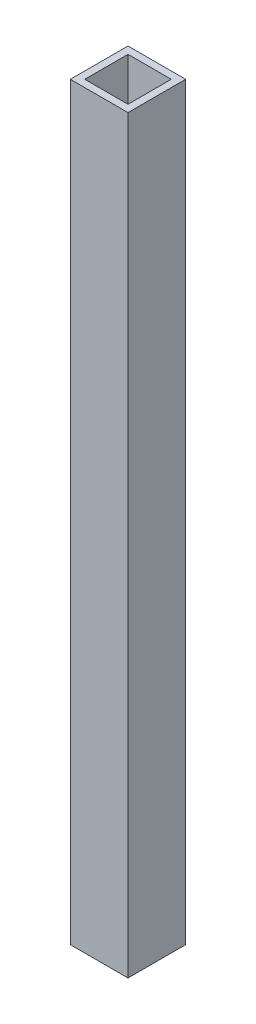
ISO-10303-21;
HEADER;
FILE_DESCRIPTION(('STEP AP214'),'2;1');
FILE_NAME('part.step','',(''),(''),'','','');
FILE_SCHEMA(('AUTOMOTIVE_DESIGN { 1 0 10303 214 1 1 1 1 }'));
ENDSEC;
DATA;
#1=APPLICATION_CONTEXT('core data for automotive mechanical design processes');
#2=APPLICATION_PROTOCOL_DEFINITION('international standard','automotive_design',2000,#1);
#3=PRODUCT_CONTEXT('',#1,'mechanical');
#4=PRODUCT('Part','Part','',(#3));
#5=PRODUCT_RELATED_PRODUCT_CATEGORY('part','',(#4));
#6=PRODUCT_DEFINITION_FORMATION('','',#4);
#7=PRODUCT_DEFINITION_CONTEXT('part definition',#1,'design');
#8=PRODUCT_DEFINITION('design','',#6,#7);
#9=PRODUCT_DEFINITION_SHAPE('','',#8);
#10=(LENGTH_UNIT() NAMED_UNIT(*) SI_UNIT(.MILLI.,.METRE.));
#11=(NAMED_UNIT(*) PLANE_ANGLE_UNIT() SI_UNIT($,.RADIAN.));
#12=(NAMED_UNIT(*) SI_UNIT($,.STERADIAN.) SOLID_ANGLE_UNIT());
#13=UNCERTAINTY_MEASURE_WITH_UNIT(LENGTH_MEASURE(1.E-05),#10,'distance_accuracy_value','');
#14=(GEOMETRIC_REPRESENTATION_CONTEXT(3) GLOBAL_UNCERTAINTY_ASSIGNED_CONTEXT((#13)) GLOBAL_UNIT_ASSIGNED_CONTEXT((#10,
#11,#12)) REPRESENTATION_CONTEXT('',''));
#15=CARTESIAN_POINT('',(0.,0.,0.));
#16=DIRECTION('',(0.,0.,1.));
#17=DIRECTION('',(1.,0.,0.));
#18=AXIS2_PLACEMENT_3D('',#15,#16,#17);
#19=CARTESIAN_POINT('',(0.,330.2,0.));
#20=DIRECTION('',(0.,1.,0.));
#21=DIRECTION('',(0.,0.,1.));
#22=AXIS2_PLACEMENT_3D('',#19,#20,#21);
#23=PLANE('',#22);
#24=DIRECTION('',(0.,0.,1.));
#25=VECTOR('',#24,1.);
#26=CARTESIAN_POINT('',(-12.7,330.2,-12.7));
#27=LINE('',#26,#25);
#28=CARTESIAN_POINT('',(-12.7,330.2,-12.7));
#29=VERTEX_POINT('',#28);
#30=CARTESIAN_POINT('',(-12.7,330.2,12.7));
#31=VERTEX_POINT('',#30);
#32=EDGE_CURVE('E134',#29,#31,#27,.T.);
#33=ORIENTED_EDGE('',*,*,#32,.T.);
#34=DIRECTION('',(1.,0.,0.));
#35=VECTOR('',#34,1.);
#36=CARTESIAN_POINT('',(-12.7,330.2,12.7));
#37=LINE('',#36,#35);
#38=CARTESIAN_POINT('',(12.7,330.2,12.7));
#39=VERTEX_POINT('',#38);
#40=EDGE_CURVE('E137',#31,#39,#37,.T.);
#41=ORIENTED_EDGE('',*,*,#40,.T.);
#42=DIRECTION('',(0.,0.,-1.));
#43=VECTOR('',#42,1.);
#44=CARTESIAN_POINT('',(12.7,330.2,-12.7));
#45=LINE('',#44,#43);
#46=CARTESIAN_POINT('',(12.7,330.2,-12.7));
#47=VERTEX_POINT('',#46);
#48=EDGE_CURVE('E140',#39,#47,#45,.T.);
#49=ORIENTED_EDGE('',*,*,#48,.T.);
#50=DIRECTION('',(-1.,0.,0.));
#51=VECTOR('',#50,1.);
#52=CARTESIAN_POINT('',(-12.7,330.2,-12.7));
#53=LINE('',#52,#51);
#54=EDGE_CURVE('E142',#47,#29,#53,.T.);
#55=ORIENTED_EDGE('',*,*,#54,.T.);
#56=EDGE_LOOP('',(#33,#41,#49,#55));
#57=FACE_BOUND('',#56,.T.);
#58=DIRECTION('',(1.,0.,0.));
#59=VECTOR('',#58,1.);
#60=CARTESIAN_POINT('',(-9.525,330.2,9.525));
#61=LINE('',#60,#59);
#62=CARTESIAN_POINT('',(-9.525,330.2,9.525));
#63=VERTEX_POINT('',#62);
#64=CARTESIAN_POINT('',(9.525,330.2,9.525));
#65=VERTEX_POINT('',#64);
#66=EDGE_CURVE('E106',#63,#65,#61,.T.);
#67=ORIENTED_EDGE('',*,*,#66,.F.);
#68=DIRECTION('',(0.,0.,1.));
#69=VECTOR('',#68,1.);
#70=CARTESIAN_POINT('',(-9.525,330.2,-9.525));
#71=LINE('',#70,#69);
#72=CARTESIAN_POINT('',(-9.525,330.2,-9.525));
#73=VERTEX_POINT('',#72);
#74=EDGE_CURVE('E98',#73,#63,#71,.T.);
#75=ORIENTED_EDGE('',*,*,#74,.F.);
#76=DIRECTION('',(-1.,0.,0.));
#77=VECTOR('',#76,1.);
#78=CARTESIAN_POINT('',(-9.525,330.2,-9.525));
#79=LINE('',#78,#77);
#80=CARTESIAN_POINT('',(9.525,330.2,-9.525));
#81=VERTEX_POINT('',#80);
#82=EDGE_CURVE('E120',#81,#73,#79,.T.);
#83=ORIENTED_EDGE('',*,*,#82,.F.);
#84=DIRECTION('',(0.,0.,-1.));
#85=VECTOR('',#84,1.);
#86=CARTESIAN_POINT('',(9.525,330.2,-9.525));
#87=LINE('',#86,#85);
#88=EDGE_CURVE('E118',#65,#81,#87,.T.);
#89=ORIENTED_EDGE('',*,*,#88,.F.);
#90=EDGE_LOOP('',(#67,#75,#83,#89));
#91=FACE_BOUND('',#90,.T.);
#92=ADVANCED_FACE('F33',(#57,#91),#23,.T.);
#93=CARTESIAN_POINT('',(0.,0.,0.));
#94=DIRECTION('',(0.,1.,0.));
#95=DIRECTION('',(0.,0.,1.));
#96=AXIS2_PLACEMENT_3D('',#93,#94,#95);
#97=PLANE('',#96);
#98=DIRECTION('',(0.,0.,1.));
#99=VECTOR('',#98,1.);
#100=CARTESIAN_POINT('',(-12.7,0.,-12.7));
#101=LINE('',#100,#99);
#102=CARTESIAN_POINT('',(-12.7,0.,-12.7));
#103=VERTEX_POINT('',#102);
#104=CARTESIAN_POINT('',(-12.7,0.,12.7));
#105=VERTEX_POINT('',#104);
#106=EDGE_CURVE('E114',#103,#105,#101,.T.);
#107=ORIENTED_EDGE('',*,*,#106,.F.);
#108=DIRECTION('',(-1.,0.,0.));
#109=VECTOR('',#108,1.);
#110=CARTESIAN_POINT('',(-12.7,0.,-12.7));
#111=LINE('',#110,#109);
#112=CARTESIAN_POINT('',(12.7,0.,-12.7));
#113=VERTEX_POINT('',#112);
#114=EDGE_CURVE('E138',#113,#103,#111,.T.);
#115=ORIENTED_EDGE('',*,*,#114,.F.);
#116=DIRECTION('',(0.,0.,-1.));
#117=VECTOR('',#116,1.);
#118=CARTESIAN_POINT('',(12.7,0.,-12.7));
#119=LINE('',#118,#117);
#120=CARTESIAN_POINT('',(12.7,0.,12.7));
#121=VERTEX_POINT('',#120);
#122=EDGE_CURVE('E149',#121,#113,#119,.T.);
#123=ORIENTED_EDGE('',*,*,#122,.F.);
#124=DIRECTION('',(1.,0.,0.));
#125=VECTOR('',#124,1.);
#126=CARTESIAN_POINT('',(-12.7,0.,12.7));
#127=LINE('',#126,#125);
#128=EDGE_CURVE('E147',#105,#121,#127,.T.);
#129=ORIENTED_EDGE('',*,*,#128,.F.);
#130=EDGE_LOOP('',(#107,#115,#123,#129));
#131=FACE_BOUND('',#130,.T.);
#132=DIRECTION('',(0.,0.,1.));
#133=VECTOR('',#132,1.);
#134=CARTESIAN_POINT('',(-9.525,0.,-9.525));
#135=LINE('',#134,#133);
#136=CARTESIAN_POINT('',(-9.525,0.,-9.525));
#137=VERTEX_POINT('',#136);
#138=CARTESIAN_POINT('',(-9.525,0.,9.525));
#139=VERTEX_POINT('',#138);
#140=EDGE_CURVE('E56',#137,#139,#135,.T.);
#141=ORIENTED_EDGE('',*,*,#140,.T.);
#142=DIRECTION('',(1.,0.,0.));
#143=VECTOR('',#142,1.);
#144=CARTESIAN_POINT('',(-9.525,0.,9.525));
#145=LINE('',#144,#143);
#146=CARTESIAN_POINT('',(9.525,0.,9.525));
#147=VERTEX_POINT('',#146);
#148=EDGE_CURVE('E113',#139,#147,#145,.T.);
#149=ORIENTED_EDGE('',*,*,#148,.T.);
#150=DIRECTION('',(0.,0.,-1.));
#151=VECTOR('',#150,1.);
#152=CARTESIAN_POINT('',(9.525,0.,-9.525));
#153=LINE('',#152,#151);
#154=CARTESIAN_POINT('',(9.525,0.,-9.525));
#155=VERTEX_POINT('',#154);
#156=EDGE_CURVE('E126',#147,#155,#153,.T.);
#157=ORIENTED_EDGE('',*,*,#156,.T.);
#158=DIRECTION('',(-1.,0.,0.));
#159=VECTOR('',#158,1.);
#160=CARTESIAN_POINT('',(-9.525,0.,-9.525));
#161=LINE('',#160,#159);
#162=EDGE_CURVE('E107',#155,#137,#161,.T.);
#163=ORIENTED_EDGE('',*,*,#162,.T.);
#164=EDGE_LOOP('',(#141,#149,#157,#163));
#165=FACE_BOUND('',#164,.T.);
#166=ADVANCED_FACE('F167',(#131,#165),#97,.F.);
#167=CARTESIAN_POINT('',(-12.7,330.2,-12.7));
#168=DIRECTION('',(1.,0.,0.));
#169=DIRECTION('',(0.,0.,-1.));
#170=AXIS2_PLACEMENT_3D('',#167,#168,#169);
#171=PLANE('',#170);
#172=ORIENTED_EDGE('',*,*,#106,.T.);
#173=DIRECTION('',(0.,-1.,0.));
#174=VECTOR('',#173,1.);
#175=CARTESIAN_POINT('',(-12.7,330.2,12.7));
#176=LINE('',#175,#174);
#177=EDGE_CURVE('E11',#31,#105,#176,.T.);
#178=ORIENTED_EDGE('',*,*,#177,.F.);
#179=ORIENTED_EDGE('',*,*,#32,.F.);
#180=DIRECTION('',(0.,-1.,0.));
#181=VECTOR('',#180,1.);
#182=CARTESIAN_POINT('',(-12.7,330.2,-12.7));
#183=LINE('',#182,#181);
#184=EDGE_CURVE('E144',#29,#103,#183,.T.);
#185=ORIENTED_EDGE('',*,*,#184,.T.);
#186=EDGE_LOOP('',(#172,#178,#179,#185));
#187=FACE_BOUND('',#186,.T.);
#188=ADVANCED_FACE('F35',(#187),#171,.F.);
#189=CARTESIAN_POINT('',(-12.7,330.2,12.7));
#190=DIRECTION('',(0.,0.,-1.));
#191=DIRECTION('',(-1.,0.,0.));
#192=AXIS2_PLACEMENT_3D('',#189,#190,#191);
#193=PLANE('',#192);
#194=ORIENTED_EDGE('',*,*,#128,.T.);
#195=DIRECTION('',(0.,-1.,0.));
#196=VECTOR('',#195,1.);
#197=CARTESIAN_POINT('',(12.7,330.2,12.7));
#198=LINE('',#197,#196);
#199=EDGE_CURVE('E41',#39,#121,#198,.T.);
#200=ORIENTED_EDGE('',*,*,#199,.F.);
#201=ORIENTED_EDGE('',*,*,#40,.F.);
#202=ORIENTED_EDGE('',*,*,#177,.T.);
#203=EDGE_LOOP('',(#194,#200,#201,#202));
#204=FACE_BOUND('',#203,.T.);
#205=ADVANCED_FACE('F177',(#204),#193,.F.);
#206=CARTESIAN_POINT('',(12.7,330.2,-12.7));
#207=DIRECTION('',(-1.,0.,0.));
#208=DIRECTION('',(0.,0.,1.));
#209=AXIS2_PLACEMENT_3D('',#206,#207,#208);
#210=PLANE('',#209);
#211=ORIENTED_EDGE('',*,*,#122,.T.);
#212=DIRECTION('',(0.,-1.,0.));
#213=VECTOR('',#212,1.);
#214=CARTESIAN_POINT('',(12.7,330.2,-12.7));
#215=LINE('',#214,#213);
#216=EDGE_CURVE('E154',#47,#113,#215,.T.);
#217=ORIENTED_EDGE('',*,*,#216,.F.);
#218=ORIENTED_EDGE('',*,*,#48,.F.);
#219=ORIENTED_EDGE('',*,*,#199,.T.);
#220=EDGE_LOOP('',(#211,#217,#218,#219));
#221=FACE_BOUND('',#220,.T.);
#222=ADVANCED_FACE('F161',(#221),#210,.F.);
#223=CARTESIAN_POINT('',(-12.7,330.2,-12.7));
#224=DIRECTION('',(0.,0.,1.));
#225=DIRECTION('',(1.,0.,0.));
#226=AXIS2_PLACEMENT_3D('',#223,#224,#225);
#227=PLANE('',#226);
#228=ORIENTED_EDGE('',*,*,#114,.T.);
#229=ORIENTED_EDGE('',*,*,#184,.F.);
#230=ORIENTED_EDGE('',*,*,#54,.F.);
#231=ORIENTED_EDGE('',*,*,#216,.T.);
#232=EDGE_LOOP('',(#228,#229,#230,#231));
#233=FACE_BOUND('',#232,.T.);
#234=ADVANCED_FACE('F171',(#233),#227,.F.);
#235=CARTESIAN_POINT('',(-9.525,330.2,-9.525));
#236=DIRECTION('',(1.,0.,0.));
#237=DIRECTION('',(0.,0.,-1.));
#238=AXIS2_PLACEMENT_3D('',#235,#236,#237);
#239=PLANE('',#238);
#240=ORIENTED_EDGE('',*,*,#140,.F.);
#241=DIRECTION('',(0.,-1.,0.));
#242=VECTOR('',#241,1.);
#243=CARTESIAN_POINT('',(-9.525,330.2,-9.525));
#244=LINE('',#243,#242);
#245=EDGE_CURVE('E102',#73,#137,#244,.T.);
#246=ORIENTED_EDGE('',*,*,#245,.F.);
#247=ORIENTED_EDGE('',*,*,#74,.T.);
#248=DIRECTION('',(0.,-1.,0.));
#249=VECTOR('',#248,1.);
#250=CARTESIAN_POINT('',(-9.525,330.2,9.525));
#251=LINE('',#250,#249);
#252=EDGE_CURVE('E101',#63,#139,#251,.T.);
#253=ORIENTED_EDGE('',*,*,#252,.T.);
#254=EDGE_LOOP('',(#240,#246,#247,#253));
#255=FACE_BOUND('',#254,.T.);
#256=ADVANCED_FACE('F100',(#255),#239,.T.);
#257=CARTESIAN_POINT('',(-9.525,330.2,9.525));
#258=DIRECTION('',(0.,0.,-1.));
#259=DIRECTION('',(-1.,0.,0.));
#260=AXIS2_PLACEMENT_3D('',#257,#258,#259);
#261=PLANE('',#260);
#262=ORIENTED_EDGE('',*,*,#148,.F.);
#263=ORIENTED_EDGE('',*,*,#252,.F.);
#264=ORIENTED_EDGE('',*,*,#66,.T.);
#265=DIRECTION('',(0.,-1.,0.));
#266=VECTOR('',#265,1.);
#267=CARTESIAN_POINT('',(9.525,330.2,9.525));
#268=LINE('',#267,#266);
#269=EDGE_CURVE('E115',#65,#147,#268,.T.);
#270=ORIENTED_EDGE('',*,*,#269,.T.);
#271=EDGE_LOOP('',(#262,#263,#264,#270));
#272=FACE_BOUND('',#271,.T.);
#273=ADVANCED_FACE('F110',(#272),#261,.T.);
#274=CARTESIAN_POINT('',(9.525,330.2,-9.525));
#275=DIRECTION('',(-1.,0.,0.));
#276=DIRECTION('',(0.,0.,1.));
#277=AXIS2_PLACEMENT_3D('',#274,#275,#276);
#278=PLANE('',#277);
#279=ORIENTED_EDGE('',*,*,#156,.F.);
#280=ORIENTED_EDGE('',*,*,#269,.F.);
#281=ORIENTED_EDGE('',*,*,#88,.T.);
#282=DIRECTION('',(0.,-1.,0.));
#283=VECTOR('',#282,1.);
#284=CARTESIAN_POINT('',(9.525,330.2,-9.525));
#285=LINE('',#284,#283);
#286=EDGE_CURVE('E48',#81,#155,#285,.T.);
#287=ORIENTED_EDGE('',*,*,#286,.T.);
#288=EDGE_LOOP('',(#279,#280,#281,#287));
#289=FACE_BOUND('',#288,.T.);
#290=ADVANCED_FACE('F200',(#289),#278,.T.);
#291=CARTESIAN_POINT('',(-9.525,330.2,-9.525));
#292=DIRECTION('',(0.,0.,1.));
#293=DIRECTION('',(1.,0.,0.));
#294=AXIS2_PLACEMENT_3D('',#291,#292,#293);
#295=PLANE('',#294);
#296=ORIENTED_EDGE('',*,*,#162,.F.);
#297=ORIENTED_EDGE('',*,*,#286,.F.);
#298=ORIENTED_EDGE('',*,*,#82,.T.);
#299=ORIENTED_EDGE('',*,*,#245,.T.);
#300=EDGE_LOOP('',(#296,#297,#298,#299));
#301=FACE_BOUND('',#300,.T.);
#302=ADVANCED_FACE('F204',(#301),#295,.T.);
#303=CLOSED_SHELL('',(#92,#166,#188,#205,#222,#234,#256,#273,#290,#302));
#304=MANIFOLD_SOLID_BREP('B2',#303);
#305=ADVANCED_BREP_SHAPE_REPRESENTATION('',(#18,#304),#14);
#306=SHAPE_DEFINITION_REPRESENTATION(#9,#305);
ENDSEC;
END-ISO-10303-21;
